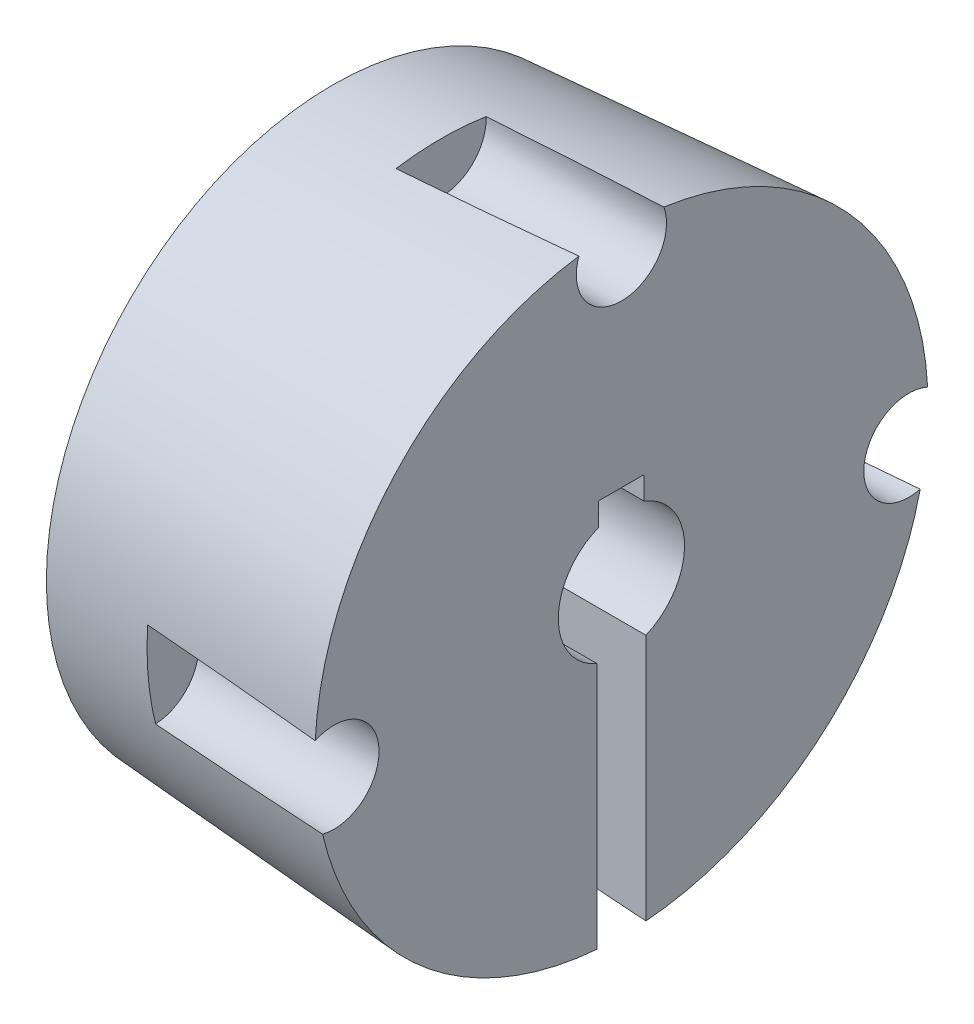
ISO-10303-21;
HEADER;
FILE_DESCRIPTION(('STEP AP214'),'2;1');
FILE_NAME('part.step','',(''),(''),'','','');
FILE_SCHEMA(('AUTOMOTIVE_DESIGN { 1 0 10303 214 1 1 1 1 }'));
ENDSEC;
DATA;
#1=APPLICATION_CONTEXT('core data for automotive mechanical design processes');
#2=APPLICATION_PROTOCOL_DEFINITION('international standard','automotive_design',2000,#1);
#3=PRODUCT_CONTEXT('',#1,'mechanical');
#4=PRODUCT('Part','Part','',(#3));
#5=PRODUCT_RELATED_PRODUCT_CATEGORY('part','',(#4));
#6=PRODUCT_DEFINITION_FORMATION('','',#4);
#7=PRODUCT_DEFINITION_CONTEXT('part definition',#1,'design');
#8=PRODUCT_DEFINITION('design','',#6,#7);
#9=PRODUCT_DEFINITION_SHAPE('','',#8);
#10=(LENGTH_UNIT() NAMED_UNIT(*) SI_UNIT(.MILLI.,.METRE.));
#11=(NAMED_UNIT(*) PLANE_ANGLE_UNIT() SI_UNIT($,.RADIAN.));
#12=(NAMED_UNIT(*) SI_UNIT($,.STERADIAN.) SOLID_ANGLE_UNIT());
#13=UNCERTAINTY_MEASURE_WITH_UNIT(LENGTH_MEASURE(1.E-05),#10,'distance_accuracy_value','');
#14=(GEOMETRIC_REPRESENTATION_CONTEXT(3) GLOBAL_UNCERTAINTY_ASSIGNED_CONTEXT((#13)) GLOBAL_UNIT_ASSIGNED_CONTEXT((#10,
#11,#12)) REPRESENTATION_CONTEXT('',''));
#15=CARTESIAN_POINT('',(0.,0.,0.));
#16=DIRECTION('',(0.,0.,1.));
#17=DIRECTION('',(1.,0.,0.));
#18=AXIS2_PLACEMENT_3D('',#15,#16,#17);
#19=CARTESIAN_POINT('',(50.8000000000003,26.9874999999999,0.));
#20=DIRECTION('',(1.,0.,0.));
#21=DIRECTION('',(0.,-0.99999999999999,0.));
#22=AXIS2_PLACEMENT_3D('',#19,#20,#21);
#23=PLANE('',#22);
#24=DIRECTION('',(0.,0.99999999999999,0.));
#25=VECTOR('',#24,1.);
#26=CARTESIAN_POINT('',(50.8,-2.69874999999997,4.31799999999999));
#27=LINE('',#26,#25);
#28=CARTESIAN_POINT('',(50.8000000000003,-53.8020027601216,4.31799999999999));
#29=VERTEX_POINT('',#28);
#30=CARTESIAN_POINT('',(50.8,-10.239264243587,4.31799999999999));
#31=VERTEX_POINT('',#30);
#32=EDGE_CURVE('E107',#29,#31,#27,.T.);
#33=ORIENTED_EDGE('',*,*,#32,.T.);
#34=CARTESIAN_POINT('',(50.8,0.,0.));
#35=DIRECTION('',(-1.,0.,0.));
#36=DIRECTION('',(0.,0.,-0.99999999999999));
#37=AXIS2_PLACEMENT_3D('',#34,#35,#36);
#38=CIRCLE('',#37,11.1125);
#39=CARTESIAN_POINT('',(50.8,10.3676253910913,4.));
#40=VERTEX_POINT('',#39);
#41=EDGE_CURVE('E104',#31,#40,#38,.T.);
#42=ORIENTED_EDGE('',*,*,#41,.T.);
#43=DIRECTION('',(0.,0.99999999999999,0.));
#44=VECTOR('',#43,1.);
#45=CARTESIAN_POINT('',(50.8,17.096875,4.));
#46=LINE('',#45,#44);
#47=CARTESIAN_POINT('',(50.8,14.4124999999999,4.));
#48=VERTEX_POINT('',#47);
#49=EDGE_CURVE('E92',#40,#48,#46,.T.);
#50=ORIENTED_EDGE('',*,*,#49,.T.);
#51=DIRECTION('',(0.,0.,-0.99999999999999));
#52=VECTOR('',#51,1.);
#53=CARTESIAN_POINT('',(50.8,14.4124999999999,0.));
#54=LINE('',#53,#52);
#55=CARTESIAN_POINT('',(50.8,14.4124999999999,-4.));
#56=VERTEX_POINT('',#55);
#57=EDGE_CURVE('E11',#48,#56,#54,.T.);
#58=ORIENTED_EDGE('',*,*,#57,.T.);
#59=DIRECTION('',(0.,-0.99999999999999,0.));
#60=VECTOR('',#59,1.);
#61=CARTESIAN_POINT('',(50.8,17.096875,-4.));
#62=LINE('',#61,#60);
#63=CARTESIAN_POINT('',(50.8,10.3676253910913,-4.));
#64=VERTEX_POINT('',#63);
#65=EDGE_CURVE('E101',#56,#64,#62,.T.);
#66=ORIENTED_EDGE('',*,*,#65,.T.);
#67=CARTESIAN_POINT('',(50.8,0.,0.));
#68=DIRECTION('',(-1.,0.,0.));
#69=DIRECTION('',(0.,0.,-0.99999999999999));
#70=AXIS2_PLACEMENT_3D('',#67,#68,#69);
#71=CIRCLE('',#70,11.1125);
#72=CARTESIAN_POINT('',(50.8,-10.239264243587,-4.31799999999999));
#73=VERTEX_POINT('',#72);
#74=EDGE_CURVE('E122',#64,#73,#71,.T.);
#75=ORIENTED_EDGE('',*,*,#74,.T.);
#76=DIRECTION('',(0.,-0.99999999999999,0.));
#77=VECTOR('',#76,1.);
#78=CARTESIAN_POINT('',(50.8,-2.69874999999997,-4.31799999999999));
#79=LINE('',#78,#77);
#80=CARTESIAN_POINT('',(50.8000000000003,-53.8020027601216,-4.31799999999999));
#81=VERTEX_POINT('',#80);
#82=EDGE_CURVE('E136',#73,#81,#79,.T.);
#83=ORIENTED_EDGE('',*,*,#82,.T.);
#84=CARTESIAN_POINT('',(50.8,0.,0.));
#85=DIRECTION('',(-1.,0.,0.));
#86=DIRECTION('',(0.,0.99999999999999,0.));
#87=AXIS2_PLACEMENT_3D('',#84,#85,#86);
#88=CIRCLE('',#87,53.975);
#89=CARTESIAN_POINT('',(50.8,-12.1109842797913,-52.5987137178713));
#90=VERTEX_POINT('',#89);
#91=EDGE_CURVE('E207',#90,#81,#88,.T.);
#92=ORIENTED_EDGE('',*,*,#91,.F.);
#93=CARTESIAN_POINT('',(50.8,-4.42751173158107,-50.6066906630601));
#94=DIRECTION('',(-1.,0.,0.));
#95=DIRECTION('',(0.,-0.996194698091736,0.0871557427476576));
#96=AXIS2_PLACEMENT_3D('',#93,#94,#95);
#97=CIRCLE('',#96,7.9375);
#98=CARTESIAN_POINT('',(50.8,2.79332043061442,-53.9026714177679));
#99=VERTEX_POINT('',#98);
#100=EDGE_CURVE('E297',#90,#99,#97,.T.);
#101=ORIENTED_EDGE('',*,*,#100,.T.);
#102=CARTESIAN_POINT('',(50.8,0.,0.));
#103=DIRECTION('',(-1.,0.,0.));
#104=DIRECTION('',(0.,0.99999999999999,0.));
#105=AXIS2_PLACEMENT_3D('',#102,#103,#104);
#106=CIRCLE('',#105,53.975);
#107=CARTESIAN_POINT('',(50.8,53.4541015625,-7.48061836654798));
#108=VERTEX_POINT('',#107);
#109=EDGE_CURVE('E294',#108,#99,#106,.T.);
#110=ORIENTED_EDGE('',*,*,#109,.F.);
#111=CARTESIAN_POINT('',(50.8,50.8,0.));
#112=DIRECTION('',(-1.,0.,0.));
#113=DIRECTION('',(0.,0.,-0.99999999999999));
#114=AXIS2_PLACEMENT_3D('',#111,#112,#113);
#115=CIRCLE('',#114,7.9375);
#116=CARTESIAN_POINT('',(50.7999999999997,53.4541015625,7.48061836654801));
#117=VERTEX_POINT('',#116);
#118=EDGE_CURVE('E181',#108,#117,#115,.T.);
#119=ORIENTED_EDGE('',*,*,#118,.T.);
#120=CARTESIAN_POINT('',(50.8,0.,0.));
#121=DIRECTION('',(-1.,0.,0.));
#122=DIRECTION('',(0.,0.99999999999999,0.));
#123=AXIS2_PLACEMENT_3D('',#120,#121,#122);
#124=CIRCLE('',#123,53.975);
#125=CARTESIAN_POINT('',(50.8,2.79332043061442,53.9026714177685));
#126=VERTEX_POINT('',#125);
#127=EDGE_CURVE('E396',#126,#117,#124,.T.);
#128=ORIENTED_EDGE('',*,*,#127,.F.);
#129=CARTESIAN_POINT('',(50.8,-4.42751173158107,50.6066906630607));
#130=DIRECTION('',(-1.,0.,0.));
#131=DIRECTION('',(0.,0.996194698091736,0.0871557427476576));
#132=AXIS2_PLACEMENT_3D('',#129,#130,#131);
#133=CIRCLE('',#132,7.9375);
#134=CARTESIAN_POINT('',(50.8,-12.1109842797913,52.5987137178719));
#135=VERTEX_POINT('',#134);
#136=EDGE_CURVE('E193',#126,#135,#133,.T.);
#137=ORIENTED_EDGE('',*,*,#136,.T.);
#138=CARTESIAN_POINT('',(50.8,0.,0.));
#139=DIRECTION('',(-1.,0.,0.));
#140=DIRECTION('',(0.,0.99999999999999,0.));
#141=AXIS2_PLACEMENT_3D('',#138,#139,#140);
#142=CIRCLE('',#141,53.975);
#143=EDGE_CURVE('E327',#29,#135,#142,.T.);
#144=ORIENTED_EDGE('',*,*,#143,.F.);
#145=EDGE_LOOP('',(#33,#42,#50,#58,#66,#75,#83,#92,#101,#110,#119,#128,#137,#144));
#146=FACE_BOUND('',#145,.T.);
#147=ADVANCED_FACE('F17',(#146),#23,.T.);
#148=CARTESIAN_POINT('',(25.4,14.4124999999999,0.));
#149=DIRECTION('',(0.,-0.99999999999999,0.));
#150=DIRECTION('',(0.,0.,-0.99999999999999));
#151=AXIS2_PLACEMENT_3D('',#148,#149,#150);
#152=PLANE('',#151);
#153=DIRECTION('',(0.,0.,0.99999999999999));
#154=VECTOR('',#153,1.);
#155=CARTESIAN_POINT('',(0.,14.4125000000001,0.));
#156=LINE('',#155,#154);
#157=CARTESIAN_POINT('',(0.,14.4125000000001,-4.));
#158=VERTEX_POINT('',#157);
#159=CARTESIAN_POINT('',(0.,14.4125000000001,4.));
#160=VERTEX_POINT('',#159);
#161=EDGE_CURVE('E130',#158,#160,#156,.T.);
#162=ORIENTED_EDGE('',*,*,#161,.F.);
#163=DIRECTION('',(1.,0.,0.));
#164=VECTOR('',#163,1.);
#165=CARTESIAN_POINT('',(25.4,14.4124999999999,-4.));
#166=LINE('',#165,#164);
#167=EDGE_CURVE('E29',#158,#56,#166,.T.);
#168=ORIENTED_EDGE('',*,*,#167,.T.);
#169=ORIENTED_EDGE('',*,*,#57,.F.);
#170=DIRECTION('',(-1.,0.,0.));
#171=VECTOR('',#170,1.);
#172=CARTESIAN_POINT('',(25.4,14.4124999999999,4.));
#173=LINE('',#172,#171);
#174=EDGE_CURVE('E99',#48,#160,#173,.T.);
#175=ORIENTED_EDGE('',*,*,#174,.T.);
#176=EDGE_LOOP('',(#162,#168,#169,#175));
#177=FACE_BOUND('',#176,.T.);
#178=ADVANCED_FACE('F380',(#177),#152,.T.);
#179=CARTESIAN_POINT('',(25.4,7.20624999999997,-4.));
#180=DIRECTION('',(0.,0.,0.99999999999999));
#181=DIRECTION('',(1.,0.,0.));
#182=AXIS2_PLACEMENT_3D('',#179,#180,#181);
#183=PLANE('',#182);
#184=DIRECTION('',(0.,0.99999999999999,0.));
#185=VECTOR('',#184,1.);
#186=CARTESIAN_POINT('',(0.,16.2102477399869,-4.));
#187=LINE('',#186,#185);
#188=CARTESIAN_POINT('',(0.,10.3676253910913,-4.));
#189=VERTEX_POINT('',#188);
#190=EDGE_CURVE('E144',#189,#158,#187,.T.);
#191=ORIENTED_EDGE('',*,*,#190,.F.);
#192=DIRECTION('',(-1.,0.,0.));
#193=VECTOR('',#192,1.);
#194=CARTESIAN_POINT('',(25.4,10.3676253910913,-4.));
#195=LINE('',#194,#193);
#196=EDGE_CURVE('E118',#64,#189,#195,.T.);
#197=ORIENTED_EDGE('',*,*,#196,.F.);
#198=ORIENTED_EDGE('',*,*,#65,.F.);
#199=ORIENTED_EDGE('',*,*,#167,.F.);
#200=EDGE_LOOP('',(#191,#197,#198,#199));
#201=FACE_BOUND('',#200,.T.);
#202=ADVANCED_FACE('F385',(#201),#183,.T.);
#203=CARTESIAN_POINT('',(25.4,7.20624999999997,4.));
#204=DIRECTION('',(0.,0.,0.99999999999999));
#205=DIRECTION('',(1.,0.,0.));
#206=AXIS2_PLACEMENT_3D('',#203,#204,#205);
#207=PLANE('',#206);
#208=DIRECTION('',(0.,-0.99999999999999,0.));
#209=VECTOR('',#208,1.);
#210=CARTESIAN_POINT('',(0.,16.2102477399869,4.));
#211=LINE('',#210,#209);
#212=CARTESIAN_POINT('',(0.,10.3676253910913,4.));
#213=VERTEX_POINT('',#212);
#214=EDGE_CURVE('E127',#160,#213,#211,.T.);
#215=ORIENTED_EDGE('',*,*,#214,.F.);
#216=ORIENTED_EDGE('',*,*,#174,.F.);
#217=ORIENTED_EDGE('',*,*,#49,.F.);
#218=DIRECTION('',(1.,0.,0.));
#219=VECTOR('',#218,1.);
#220=CARTESIAN_POINT('',(25.4,10.3676253910913,4.));
#221=LINE('',#220,#219);
#222=EDGE_CURVE('E97',#213,#40,#221,.T.);
#223=ORIENTED_EDGE('',*,*,#222,.F.);
#224=EDGE_LOOP('',(#215,#216,#217,#223));
#225=FACE_BOUND('',#224,.T.);
#226=ADVANCED_FACE('F95',(#225),#207,.F.);
#227=CARTESIAN_POINT('',(35.425,50.8,0.));
#228=DIRECTION('',(-1.,0.,0.));
#229=DIRECTION('',(0.,0.,-0.99999999999999));
#230=AXIS2_PLACEMENT_3D('',#227,#228,#229);
#231=CYLINDRICAL_SURFACE('',#230,7.9375);
#232=CARTESIAN_POINT('',(50.799999805005,53.4541022964206,7.48061302395771));
#233=CARTESIAN_POINT('',(49.514978922678,53.3587850836459,7.51441898743919));
#234=CARTESIAN_POINT('',(48.2298867545498,53.2636951436941,7.54613709674325));
#235=CARTESIAN_POINT('',(45.6488956919907,53.0731888290846,7.60578888716443));
#236=CARTESIAN_POINT('',(44.352995734979,52.9777763080407,7.63368893022825));
#237=CARTESIAN_POINT('',(41.7503892444708,52.7866429948181,7.68575248162218));
#238=CARTESIAN_POINT('',(40.4436817677069,52.6909261544705,7.7098832611031));
#239=CARTESIAN_POINT('',(37.8194600467456,52.4991992518682,7.75445527496117));
#240=CARTESIAN_POINT('',(36.5019449687711,52.4031932114218,7.77486466380585));
#241=CARTESIAN_POINT('',(33.8561079601392,52.2109008902522,7.81204192455714));
#242=CARTESIAN_POINT('',(32.5277852993965,52.1146186824218,7.82877882473873));
#243=CARTESIAN_POINT('',(29.8603330027997,51.9217846637942,7.85865951737831));
#244=CARTESIAN_POINT('',(28.5212027338716,51.8252369564056,7.8717731972064));
#245=CARTESIAN_POINT('',(25.8321351804027,51.6318805225556,7.89445682835092));
#246=CARTESIAN_POINT('',(24.4821973543677,51.535075912392,7.90399751641036));
#247=CARTESIAN_POINT('',(21.7715143905531,51.3412115582531,7.91958373386601));
#248=CARTESIAN_POINT('',(20.4107687949942,51.2441559212239,7.92560082561534));
#249=CARTESIAN_POINT('',(19.0499997828104,51.1473582909177,7.92988057025765));
#250=B_SPLINE_CURVE_WITH_KNOTS('',3,(#232,#233,#234,#235,#236,#237,#238,#239,#240,#241,#242,
#243,#244,#245,#246,#247,#248,#249),.UNSPECIFIED.,.F.,.F.,(4,2,2,2,2,2,2,2,4),(0.,
3.86698113531609,7.76609610012456,11.6973820066438,15.6608743448186,19.6566070275359,
23.6846124344701,27.744921454614,31.8375635275536),.UNSPECIFIED.);
#251=CARTESIAN_POINT('',(19.05,51.1473559184813,7.92989597131616));
#252=VERTEX_POINT('',#251);
#253=EDGE_CURVE('E201',#117,#252,#250,.T.);
#254=ORIENTED_EDGE('',*,*,#253,.F.);
#255=ORIENTED_EDGE('',*,*,#118,.F.);
#256=CARTESIAN_POINT('',(19.0499997828104,51.1473582909177,-7.92988057025767));
#257=CARTESIAN_POINT('',(20.4107687949943,51.244155921224,-7.92560082561537));
#258=CARTESIAN_POINT('',(21.7715143905534,51.3412115582532,-7.91958373386603));
#259=CARTESIAN_POINT('',(24.4821973543682,51.535075912392,-7.90399751641037));
#260=CARTESIAN_POINT('',(25.8321351804033,51.6318805225557,-7.89445682835091));
#261=CARTESIAN_POINT('',(28.5212027338724,51.8252369564056,-7.87177319720639));
#262=CARTESIAN_POINT('',(29.8603330028005,51.9217846637943,-7.85865951737831));
#263=CARTESIAN_POINT('',(32.5277852993974,52.1146186824218,-7.82877882473873));
#264=CARTESIAN_POINT('',(33.8561079601401,52.2109008902523,-7.81204192455713));
#265=CARTESIAN_POINT('',(36.501944968772,52.4031932114218,-7.77486466380586));
#266=CARTESIAN_POINT('',(37.8194600467465,52.4991992518682,-7.75445527496119));
#267=CARTESIAN_POINT('',(40.4436817677077,52.6909261544706,-7.70988326110314));
#268=CARTESIAN_POINT('',(41.7503892444715,52.7866429948182,-7.68575248162221));
#269=CARTESIAN_POINT('',(44.3529957349796,52.9777763080407,-7.6336889302283));
#270=CARTESIAN_POINT('',(45.6488956919912,53.0731888290846,-7.60578888716451));
#271=CARTESIAN_POINT('',(48.22988675455,53.2636951436941,-7.54613709674335));
#272=CARTESIAN_POINT('',(49.5149789226781,53.3587850836458,-7.5144189874393));
#273=CARTESIAN_POINT('',(50.799999805005,53.4541022964206,-7.48061302395779));
#274=B_SPLINE_CURVE_WITH_KNOTS('',3,(#256,#257,#258,#259,#260,#261,#262,#263,#264,#265,#266,
#267,#268,#269,#270,#271,#272,#273),.UNSPECIFIED.,.F.,.F.,(4,2,2,2,2,2,2,2,4),(0.,
4.09264207294004,8.15295109308427,12.1809565000186,16.176689182736,20.1401815209107,
24.0714674274298,27.9705823922379,31.8375635275536),.UNSPECIFIED.);
#275=CARTESIAN_POINT('',(19.05,51.1473559184813,-7.92989597131555));
#276=VERTEX_POINT('',#275);
#277=EDGE_CURVE('E200',#276,#108,#274,.T.);
#278=ORIENTED_EDGE('',*,*,#277,.F.);
#279=CARTESIAN_POINT('',(19.05,50.8,0.));
#280=DIRECTION('',(-1.,0.,0.));
#281=DIRECTION('',(0.,0.,-0.99999999999999));
#282=AXIS2_PLACEMENT_3D('',#279,#280,#281);
#283=CIRCLE('',#282,7.9375);
#284=EDGE_CURVE('E190',#276,#252,#283,.T.);
#285=ORIENTED_EDGE('',*,*,#284,.T.);
#286=EDGE_LOOP('',(#254,#255,#278,#285));
#287=FACE_BOUND('',#286,.T.);
#288=ADVANCED_FACE('F408',(#287),#231,.F.);
#289=CARTESIAN_POINT('',(19.05,50.8,0.));
#290=DIRECTION('',(-1.,0.,0.));
#291=DIRECTION('',(0.,0.,0.99999999999999));
#292=AXIS2_PLACEMENT_3D('',#289,#290,#291);
#293=PLANE('',#292);
#294=CARTESIAN_POINT('',(19.05,0.,0.));
#295=DIRECTION('',(-1.,0.,0.));
#296=DIRECTION('',(0.,0.99999999999999,0.));
#297=AXIS2_PLACEMENT_3D('',#294,#295,#296);
#298=CIRCLE('',#297,51.7584318499672);
#299=EDGE_CURVE('E196',#252,#276,#298,.T.);
#300=ORIENTED_EDGE('',*,*,#299,.F.);
#301=ORIENTED_EDGE('',*,*,#284,.F.);
#302=EDGE_LOOP('',(#300,#301));
#303=FACE_BOUND('',#302,.T.);
#304=ADVANCED_FACE('F343',(#303),#293,.F.);
#305=CARTESIAN_POINT('',(35.425,-4.42751173158107,50.6066906630607));
#306=DIRECTION('',(-1.,0.,0.));
#307=DIRECTION('',(0.,0.996194698091736,0.0871557427476576));
#308=AXIS2_PLACEMENT_3D('',#305,#306,#307);
#309=CYLINDRICAL_SURFACE('',#308,7.9375);
#310=CARTESIAN_POINT('',(50.79999980487,-12.110979017855,52.598714915466));
#311=CARTESIAN_POINT('',(49.514978805904,-12.136348896836,52.5008140212835));
#312=CARTESIAN_POINT('',(48.2298865211529,-12.1596586750307,52.40332150348));
#313=CARTESIAN_POINT('',(45.6488952586678,-12.2024797533049,52.2083411124137));
#314=CARTESIAN_POINT('',(44.3529952183565,-12.2219578793088,52.1108600098275));
#315=CARTESIAN_POINT('',(41.7503885945686,-12.2571649474913,51.9159163694589));
#316=CARTESIAN_POINT('',(40.4436810678276,-12.2728616298941,51.8184606209543));
#317=CARTESIAN_POINT('',(37.8194592802323,-12.3005539333526,51.623578585291));
#318=CARTESIAN_POINT('',(36.5019441856034,-12.3125181806826,51.5261590801355));
#319=CARTESIAN_POINT('',(33.8561071769833,-12.3327945908494,51.3313582774691));
#320=CARTESIAN_POINT('',(32.527784532909,-12.341076254891,51.2339837366945));
#321=CARTESIAN_POINT('',(29.8603323029698,-12.3540366506114,51.0392792404781));
#322=CARTESIAN_POINT('',(28.5212020840329,-12.3586857419764,50.9419559972976));
#323=CARTESIAN_POINT('',(25.8321346638673,-12.3644309318087,50.7473583438149));
#324=CARTESIAN_POINT('',(24.4821969211463,-12.3654982372224,50.6500905845869));
#325=CARTESIAN_POINT('',(21.7715141572812,-12.364128753136,50.4556055287301));
#326=CARTESIAN_POINT('',(20.4107686783593,-12.3616639922319,50.3583948019035));
#327=CARTESIAN_POINT('',(19.0499997828111,-12.3574909820625,50.2615925197989));
#328=B_SPLINE_CURVE_WITH_KNOTS('',3,(#310,#311,#312,#313,#314,#315,#316,#317,#318,#319,#320,
#321,#322,#323,#324,#325,#326,#327),.UNSPECIFIED.,.F.,.F.,(4,2,2,2,2,2,2,2,4),(0.,
3.86698148604562,7.76609670138385,11.697382758223,15.6608751465004,19.6566077790979,
23.6846130356868,27.744921805259,31.8375635274014),.UNSPECIFIED.);
#329=CARTESIAN_POINT('',(19.05,-12.3575061176983,50.2615888141108));
#330=VERTEX_POINT('',#329);
#331=EDGE_CURVE('E215',#135,#330,#328,.T.);
#332=ORIENTED_EDGE('',*,*,#331,.F.);
#333=ORIENTED_EDGE('',*,*,#136,.F.);
#334=CARTESIAN_POINT('',(19.0499997828111,3.44191897921248,51.643861781809));
#335=CARTESIAN_POINT('',(20.4107686783593,3.42921905209928,51.7399180553462));
#336=CARTESIAN_POINT('',(21.7715141572811,3.41476590218385,51.8360799340404));
#337=CARTESIAN_POINT('',(24.4821969211461,3.38234260519683,52.0278481333091));
#338=CARTESIAN_POINT('',(25.8321346638672,3.36440114541492,52.1234528410748));
#339=CARTESIAN_POINT('',(28.5212020840327,3.32495171002004,52.3140964771979));
#340=CARTESIAN_POINT('',(29.8603323029696,3.30347324497638,52.409133855387));
#341=CARTESIAN_POINT('',(32.5277845329087,3.25689966583733,52.5986298037086));
#342=CARTESIAN_POINT('',(33.856107176983,3.23183490732465,52.6930869105406));
#343=CARTESIAN_POINT('',(36.5019441856032,3.17803973699804,52.8814072896243));
#344=CARTESIAN_POINT('',(37.819459280232,3.14934053392906,52.97526920385));
#345=CARTESIAN_POINT('',(40.4436810678274,3.08822802843143,53.1623818254631));
#346=CARTESIAN_POINT('',(41.7503885945684,3.05584680077351,53.2556313018713));
#347=CARTESIAN_POINT('',(44.3529952183563,2.98732299916882,53.4414996670759));
#348=CARTESIAN_POINT('',(45.6488952586676,2.95121337384492,53.53411747159));
#349=CARTESIAN_POINT('',(48.2298865211528,2.8751848543787,53.7186998701894));
#350=CARTESIAN_POINT('',(49.5149788059039,2.8352998060388,53.8106635570777));
#351=CARTESIAN_POINT('',(50.7999998048699,2.79331504065851,53.9026716834427));
#352=B_SPLINE_CURVE_WITH_KNOTS('',3,(#334,#335,#336,#337,#338,#339,#340,#341,#342,#343,#344,
#345,#346,#347,#348,#349,#350,#351),.UNSPECIFIED.,.F.,.F.,(4,2,2,2,2,2,2,2,4),(0.,
4.09264172214225,8.15295049171443,12.1809557483032,16.1766883809008,20.1401807691782,
24.0714668260173,27.9705820413556,31.8375635274014),.UNSPECIFIED.);
#353=CARTESIAN_POINT('',(19.05,3.44193452839014,51.6438607606942));
#354=VERTEX_POINT('',#353);
#355=EDGE_CURVE('E214',#354,#126,#352,.T.);
#356=ORIENTED_EDGE('',*,*,#355,.F.);
#357=CARTESIAN_POINT('',(19.05,-4.42751173158107,50.6066906630607));
#358=DIRECTION('',(-1.,0.,0.));
#359=DIRECTION('',(0.,0.996194698091736,0.0871557427476576));
#360=AXIS2_PLACEMENT_3D('',#357,#358,#359);
#361=CIRCLE('',#360,7.9375);
#362=EDGE_CURVE('E204',#354,#330,#361,.T.);
#363=ORIENTED_EDGE('',*,*,#362,.T.);
#364=EDGE_LOOP('',(#332,#333,#356,#363));
#365=FACE_BOUND('',#364,.T.);
#366=ADVANCED_FACE('F334',(#365),#309,.F.);
#367=CARTESIAN_POINT('',(19.05,-4.42751173158107,50.6066906630607));
#368=DIRECTION('',(-1.,0.,0.));
#369=DIRECTION('',(0.,-0.996194698091736,-0.0871557427476576));
#370=AXIS2_PLACEMENT_3D('',#367,#368,#369);
#371=PLANE('',#370);
#372=CARTESIAN_POINT('',(19.05,0.,0.));
#373=DIRECTION('',(-1.,0.,0.));
#374=DIRECTION('',(0.,0.99999999999999,0.));
#375=AXIS2_PLACEMENT_3D('',#372,#373,#374);
#376=CIRCLE('',#375,51.7584318499672);
#377=EDGE_CURVE('E210',#330,#354,#376,.T.);
#378=ORIENTED_EDGE('',*,*,#377,.F.);
#379=ORIENTED_EDGE('',*,*,#362,.F.);
#380=EDGE_LOOP('',(#378,#379));
#381=FACE_BOUND('',#380,.T.);
#382=ADVANCED_FACE('F238',(#381),#371,.F.);
#383=CARTESIAN_POINT('',(25.4,0.,0.));
#384=DIRECTION('',(1.,0.,0.));
#385=DIRECTION('',(0.,0.99999999999999,0.));
#386=AXIS2_PLACEMENT_3D('',#383,#384,#385);
#387=CONICAL_SURFACE('',#386,52.2017454799738,0.0697000802996148);
#388=CARTESIAN_POINT('',(0.,-50.2432838944434,4.31799999999999));
#389=CARTESIAN_POINT('',(24.5314194599456,-51.9622131084392,4.318));
#390=CARTESIAN_POINT('',(50.8004029604262,-53.8020309825229,4.31799999999999));
#391=(BOUNDED_CURVE() B_SPLINE_CURVE(2,(#388,#389,#390),.UNSPECIFIED.,.F.,
.F.) B_SPLINE_CURVE_WITH_KNOTS((3,3),(0.,50.9249017863725),
.UNSPECIFIED.) CURVE() GEOMETRIC_REPRESENTATION_ITEM() RATIONAL_B_SPLINE_CURVE((1.,
1.00058144522512,1.)) REPRESENTATION_ITEM(''));
#392=CARTESIAN_POINT('',(0.,-50.2432838944434,4.31799999999999));
#393=VERTEX_POINT('',#392);
#394=EDGE_CURVE('E137',#393,#29,#391,.T.);
#395=ORIENTED_EDGE('',*,*,#394,.T.);
#396=ORIENTED_EDGE('',*,*,#143,.T.);
#397=ORIENTED_EDGE('',*,*,#331,.T.);
#398=ORIENTED_EDGE('',*,*,#377,.T.);
#399=ORIENTED_EDGE('',*,*,#355,.T.);
#400=ORIENTED_EDGE('',*,*,#127,.T.);
#401=ORIENTED_EDGE('',*,*,#253,.T.);
#402=ORIENTED_EDGE('',*,*,#299,.T.);
#403=ORIENTED_EDGE('',*,*,#277,.T.);
#404=ORIENTED_EDGE('',*,*,#109,.T.);
#405=CARTESIAN_POINT('',(50.79999980487,2.79331504065842,-53.9026716834427));
#406=CARTESIAN_POINT('',(49.5149788059021,2.83529980603872,-53.8106635570776));
#407=CARTESIAN_POINT('',(48.2298865211493,2.87518485437864,-53.7186998701891));
#408=CARTESIAN_POINT('',(45.648895258661,2.95121337384488,-53.5341174715896));
#409=CARTESIAN_POINT('',(44.3529952183485,2.98732299916878,-53.4414996670754));
#410=CARTESIAN_POINT('',(41.7503885945585,3.05584680077347,-53.2556313018707));
#411=CARTESIAN_POINT('',(40.4436810678168,3.08822802843139,-53.1623818254623));
#412=CARTESIAN_POINT('',(37.8194592802204,3.14934053392901,-52.9752692038492));
#413=CARTESIAN_POINT('',(36.5019441855913,3.178039736998,-52.8814072896235));
#414=CARTESIAN_POINT('',(33.8561071769712,3.23183490732465,-52.6930869105397));
#415=CARTESIAN_POINT('',(32.5277845328971,3.25689966583737,-52.5986298037078));
#416=CARTESIAN_POINT('',(29.860332302959,3.30347324497639,-52.4091338553863));
#417=CARTESIAN_POINT('',(28.5212020840228,3.32495171001999,-52.3140964771972));
#418=CARTESIAN_POINT('',(25.8321346638593,3.36440114541486,-52.1234528410743));
#419=CARTESIAN_POINT('',(24.4821969211396,3.38234260519681,-52.0278481333087));
#420=CARTESIAN_POINT('',(21.7715141572776,3.41476590218388,-51.8360799340402));
#421=CARTESIAN_POINT('',(20.4107686783575,3.42921905209931,-51.7399180553461));
#422=CARTESIAN_POINT('',(19.0499997828111,3.44191897921241,-51.6438617818091));
#423=B_SPLINE_CURVE_WITH_KNOTS('',3,(#405,#406,#407,#408,#409,#410,#411,#412,#413,#414,#415,
#416,#417,#418,#419,#420,#421,#422),.UNSPECIFIED.,.F.,.F.,(4,2,2,2,2,2,2,2,4),(0.,
3.86698148605105,7.76609670139314,11.6973827582346,15.6608751465128,19.6566077791095,
23.6846130356961,27.7449218052644,31.8375635274014),.UNSPECIFIED.);
#424=CARTESIAN_POINT('',(19.05,3.44193452839014,-51.6438607606943));
#425=VERTEX_POINT('',#424);
#426=EDGE_CURVE('E301',#99,#425,#423,.T.);
#427=ORIENTED_EDGE('',*,*,#426,.T.);
#428=CARTESIAN_POINT('',(19.05,0.,0.));
#429=DIRECTION('',(-1.,0.,0.));
#430=DIRECTION('',(0.,0.99999999999999,0.));
#431=AXIS2_PLACEMENT_3D('',#428,#429,#430);
#432=CIRCLE('',#431,51.7584318499672);
#433=CARTESIAN_POINT('',(19.05,-12.3575061176983,-50.2615888141108));
#434=VERTEX_POINT('',#433);
#435=EDGE_CURVE('E112',#425,#434,#432,.T.);
#436=ORIENTED_EDGE('',*,*,#435,.T.);
#437=CARTESIAN_POINT('',(19.0499997828111,-12.3574909820623,-50.2615925197989));
#438=CARTESIAN_POINT('',(20.4107686783576,-12.3616639922318,-50.3583948019034));
#439=CARTESIAN_POINT('',(21.7715141572777,-12.3641287531359,-50.4556055287299));
#440=CARTESIAN_POINT('',(24.4821969211397,-12.3654982372223,-50.6500905845865));
#441=CARTESIAN_POINT('',(25.8321346638596,-12.3644309318085,-50.7473583438143));
#442=CARTESIAN_POINT('',(28.5212020840231,-12.3586857419763,-50.9419559972969));
#443=CARTESIAN_POINT('',(29.8603323029593,-12.3540366506113,-51.0392792404774));
#444=CARTESIAN_POINT('',(32.5277845328975,-12.3410762548909,-51.2339837366937));
#445=CARTESIAN_POINT('',(33.8561071769715,-12.3327945908493,-51.3313582774683));
#446=CARTESIAN_POINT('',(36.5019441855917,-12.3125181806825,-51.5261590801347));
#447=CARTESIAN_POINT('',(37.8194592802207,-12.3005539333525,-51.6235785852902));
#448=CARTESIAN_POINT('',(40.4436810678171,-12.272861629894,-51.8184606209536));
#449=CARTESIAN_POINT('',(41.7503885945588,-12.2571649474912,-51.9159163694582));
#450=CARTESIAN_POINT('',(44.3529952183487,-12.2219578793087,-52.110860009827));
#451=CARTESIAN_POINT('',(45.6488952586612,-12.2024797533047,-52.2083411124133));
#452=CARTESIAN_POINT('',(48.2298865211494,-12.1596586750305,-52.4033215034798));
#453=CARTESIAN_POINT('',(49.5149788059022,-12.1363488968358,-52.5008140212835));
#454=CARTESIAN_POINT('',(50.79999980487,-12.1109790178548,-52.598714915466));
#455=B_SPLINE_CURVE_WITH_KNOTS('',3,(#437,#438,#439,#440,#441,#442,#443,#444,#445,#446,#447,
#448,#449,#450,#451,#452,#453,#454),.UNSPECIFIED.,.F.,.F.,(4,2,2,2,2,2,2,2,4),(0.,
4.09264172213709,8.15295049170558,12.1809557482922,16.176688380889,20.1401807691671,
24.0714668260085,27.9705820413505,31.8375635274014),.UNSPECIFIED.);
#456=EDGE_CURVE('E281',#434,#90,#455,.T.);
#457=ORIENTED_EDGE('',*,*,#456,.T.);
#458=ORIENTED_EDGE('',*,*,#91,.T.);
#459=CARTESIAN_POINT('',(50.8004029604262,-53.8020309825229,-4.31799999999999));
#460=CARTESIAN_POINT('',(24.5314194599457,-51.9622131084394,-4.31799999999999));
#461=CARTESIAN_POINT('',(0.,-50.2432838944434,-4.31799999999999));
#462=(BOUNDED_CURVE() B_SPLINE_CURVE(2,(#459,#460,#461),.UNSPECIFIED.,.F.,
.F.) B_SPLINE_CURVE_WITH_KNOTS((3,3),(0.,50.9249017863725),
.UNSPECIFIED.) CURVE() GEOMETRIC_REPRESENTATION_ITEM() RATIONAL_B_SPLINE_CURVE((1.,
1.00058144523088,1.)) REPRESENTATION_ITEM(''));
#463=CARTESIAN_POINT('',(0.,-50.2432838944434,-4.31799999999999));
#464=VERTEX_POINT('',#463);
#465=EDGE_CURVE('E155',#81,#464,#462,.T.);
#466=ORIENTED_EDGE('',*,*,#465,.T.);
#467=CARTESIAN_POINT('',(0.,0.,0.));
#468=DIRECTION('',(-1.,0.,0.));
#469=DIRECTION('',(0.,0.99999999999999,0.));
#470=AXIS2_PLACEMENT_3D('',#467,#468,#469);
#471=CIRCLE('',#470,50.4284909599475);
#472=EDGE_CURVE('E125',#393,#464,#471,.T.);
#473=ORIENTED_EDGE('',*,*,#472,.F.);
#474=EDGE_LOOP('',(#395,#396,#397,#398,#399,#400,#401,#402,#403,#404,#427,#436,#457,#458,#466,#473));
#475=FACE_BOUND('',#474,.T.);
#476=ADVANCED_FACE('F228',(#475),#387,.T.);
#477=CARTESIAN_POINT('',(35.4250000000002,-4.42751173158107,-50.6066906630601));
#478=DIRECTION('',(-1.,0.,0.));
#479=DIRECTION('',(0.,-0.996194698091736,0.0871557427476576));
#480=AXIS2_PLACEMENT_3D('',#477,#478,#479);
#481=CYLINDRICAL_SURFACE('',#480,7.9375);
#482=ORIENTED_EDGE('',*,*,#426,.F.);
#483=ORIENTED_EDGE('',*,*,#100,.F.);
#484=ORIENTED_EDGE('',*,*,#456,.F.);
#485=CARTESIAN_POINT('',(19.05,-4.42751173158107,-50.6066906630607));
#486=DIRECTION('',(-1.,0.,0.));
#487=DIRECTION('',(0.,-0.996194698091736,0.0871557427476576));
#488=AXIS2_PLACEMENT_3D('',#485,#486,#487);
#489=CIRCLE('',#488,7.9375);
#490=EDGE_CURVE('E313',#434,#425,#489,.T.);
#491=ORIENTED_EDGE('',*,*,#490,.T.);
#492=EDGE_LOOP('',(#482,#483,#484,#491));
#493=FACE_BOUND('',#492,.T.);
#494=ADVANCED_FACE('F237',(#493),#481,.F.);
#495=CARTESIAN_POINT('',(19.05,-4.42751173158107,-50.6066906630607));
#496=DIRECTION('',(-1.,0.,0.));
#497=DIRECTION('',(0.,0.996194698091736,-0.0871557427476576));
#498=AXIS2_PLACEMENT_3D('',#495,#496,#497);
#499=PLANE('',#498);
#500=ORIENTED_EDGE('',*,*,#435,.F.);
#501=ORIENTED_EDGE('',*,*,#490,.F.);
#502=EDGE_LOOP('',(#500,#501));
#503=FACE_BOUND('',#502,.T.);
#504=ADVANCED_FACE('F239',(#503),#499,.F.);
#505=CARTESIAN_POINT('',(25.4,0.,0.));
#506=DIRECTION('',(-1.,0.,0.));
#507=DIRECTION('',(0.,0.,-0.99999999999999));
#508=AXIS2_PLACEMENT_3D('',#505,#506,#507);
#509=CYLINDRICAL_SURFACE('',#508,11.1125);
#510=DIRECTION('',(-1.,0.,0.));
#511=VECTOR('',#510,1.);
#512=CARTESIAN_POINT('',(25.4,-10.239264243587,4.31799999999999));
#513=LINE('',#512,#511);
#514=CARTESIAN_POINT('',(0.,-10.239264243587,4.31799999999999));
#515=VERTEX_POINT('',#514);
#516=EDGE_CURVE('E174',#31,#515,#513,.T.);
#517=ORIENTED_EDGE('',*,*,#516,.T.);
#518=CARTESIAN_POINT('',(0.,0.,0.));
#519=DIRECTION('',(1.,0.,0.));
#520=DIRECTION('',(0.,0.,-0.99999999999999));
#521=AXIS2_PLACEMENT_3D('',#518,#519,#520);
#522=CIRCLE('',#521,11.1125);
#523=EDGE_CURVE('E115',#213,#515,#522,.T.);
#524=ORIENTED_EDGE('',*,*,#523,.F.);
#525=ORIENTED_EDGE('',*,*,#222,.T.);
#526=ORIENTED_EDGE('',*,*,#41,.F.);
#527=EDGE_LOOP('',(#517,#524,#525,#526));
#528=FACE_BOUND('',#527,.T.);
#529=ADVANCED_FACE('F114',(#528),#509,.F.);
#530=CARTESIAN_POINT('',(25.4,0.,0.));
#531=DIRECTION('',(-1.,0.,0.));
#532=DIRECTION('',(0.,0.,-0.99999999999999));
#533=AXIS2_PLACEMENT_3D('',#530,#531,#532);
#534=CYLINDRICAL_SURFACE('',#533,11.1125);
#535=DIRECTION('',(1.,0.,0.));
#536=VECTOR('',#535,1.);
#537=CARTESIAN_POINT('',(25.4,-10.239264243587,-4.31799999999999));
#538=LINE('',#537,#536);
#539=CARTESIAN_POINT('',(0.,-10.239264243587,-4.31799999999999));
#540=VERTEX_POINT('',#539);
#541=EDGE_CURVE('E131',#540,#73,#538,.T.);
#542=ORIENTED_EDGE('',*,*,#541,.T.);
#543=ORIENTED_EDGE('',*,*,#74,.F.);
#544=ORIENTED_EDGE('',*,*,#196,.T.);
#545=CARTESIAN_POINT('',(0.,0.,0.));
#546=DIRECTION('',(1.,0.,0.));
#547=DIRECTION('',(0.,0.,-0.99999999999999));
#548=AXIS2_PLACEMENT_3D('',#545,#546,#547);
#549=CIRCLE('',#548,11.1125);
#550=EDGE_CURVE('E150',#540,#189,#549,.T.);
#551=ORIENTED_EDGE('',*,*,#550,.F.);
#552=EDGE_LOOP('',(#542,#543,#544,#551));
#553=FACE_BOUND('',#552,.T.);
#554=ADVANCED_FACE('F377',(#553),#534,.F.);
#555=CARTESIAN_POINT('',(0.,25.2142454799738,0.));
#556=DIRECTION('',(-1.,0.,0.));
#557=DIRECTION('',(0.,0.99999999999999,0.));
#558=AXIS2_PLACEMENT_3D('',#555,#556,#557);
#559=PLANE('',#558);
#560=DIRECTION('',(0.,-0.99999999999999,0.));
#561=VECTOR('',#560,1.);
#562=CARTESIAN_POINT('',(0.,-3.58537726001307,4.31799999999999));
#563=LINE('',#562,#561);
#564=EDGE_CURVE('E143',#515,#393,#563,.T.);
#565=ORIENTED_EDGE('',*,*,#564,.T.);
#566=ORIENTED_EDGE('',*,*,#472,.T.);
#567=DIRECTION('',(0.,0.99999999999999,0.));
#568=VECTOR('',#567,1.);
#569=CARTESIAN_POINT('',(0.,-3.58537726001307,-4.31799999999999));
#570=LINE('',#569,#568);
#571=EDGE_CURVE('E135',#464,#540,#570,.T.);
#572=ORIENTED_EDGE('',*,*,#571,.T.);
#573=ORIENTED_EDGE('',*,*,#550,.T.);
#574=ORIENTED_EDGE('',*,*,#190,.T.);
#575=ORIENTED_EDGE('',*,*,#161,.T.);
#576=ORIENTED_EDGE('',*,*,#214,.T.);
#577=ORIENTED_EDGE('',*,*,#523,.T.);
#578=EDGE_LOOP('',(#565,#566,#572,#573,#574,#575,#576,#577));
#579=FACE_BOUND('',#578,.T.);
#580=ADVANCED_FACE('F488',(#579),#559,.T.);
#581=CARTESIAN_POINT('',(25.4,-32.385,-4.31799999999999));
#582=DIRECTION('',(0.,0.,0.99999999999999));
#583=DIRECTION('',(1.,0.,0.));
#584=AXIS2_PLACEMENT_3D('',#581,#582,#583);
#585=PLANE('',#584);
#586=ORIENTED_EDGE('',*,*,#465,.F.);
#587=ORIENTED_EDGE('',*,*,#82,.F.);
#588=ORIENTED_EDGE('',*,*,#541,.F.);
#589=ORIENTED_EDGE('',*,*,#571,.F.);
#590=EDGE_LOOP('',(#586,#587,#588,#589));
#591=FACE_BOUND('',#590,.T.);
#592=ADVANCED_FACE('F418',(#591),#585,.T.);
#593=CARTESIAN_POINT('',(25.4,-32.385,4.31799999999999));
#594=DIRECTION('',(0.,0.,0.99999999999999));
#595=DIRECTION('',(1.,0.,0.));
#596=AXIS2_PLACEMENT_3D('',#593,#594,#595);
#597=PLANE('',#596);
#598=ORIENTED_EDGE('',*,*,#394,.F.);
#599=ORIENTED_EDGE('',*,*,#564,.F.);
#600=ORIENTED_EDGE('',*,*,#516,.F.);
#601=ORIENTED_EDGE('',*,*,#32,.F.);
#602=EDGE_LOOP('',(#598,#599,#600,#601));
#603=FACE_BOUND('',#602,.T.);
#604=ADVANCED_FACE('F19',(#603),#597,.F.);
#605=CLOSED_SHELL('',(#147,#178,#202,#226,#288,#304,#366,#382,#476,#494,#504,#529,#554,#580,
#592,#604));
#606=MANIFOLD_SOLID_BREP('B1',#605);
#607=ADVANCED_BREP_SHAPE_REPRESENTATION('',(#18,#606),#14);
#608=SHAPE_DEFINITION_REPRESENTATION(#9,#607);
ENDSEC;
END-ISO-10303-21;
